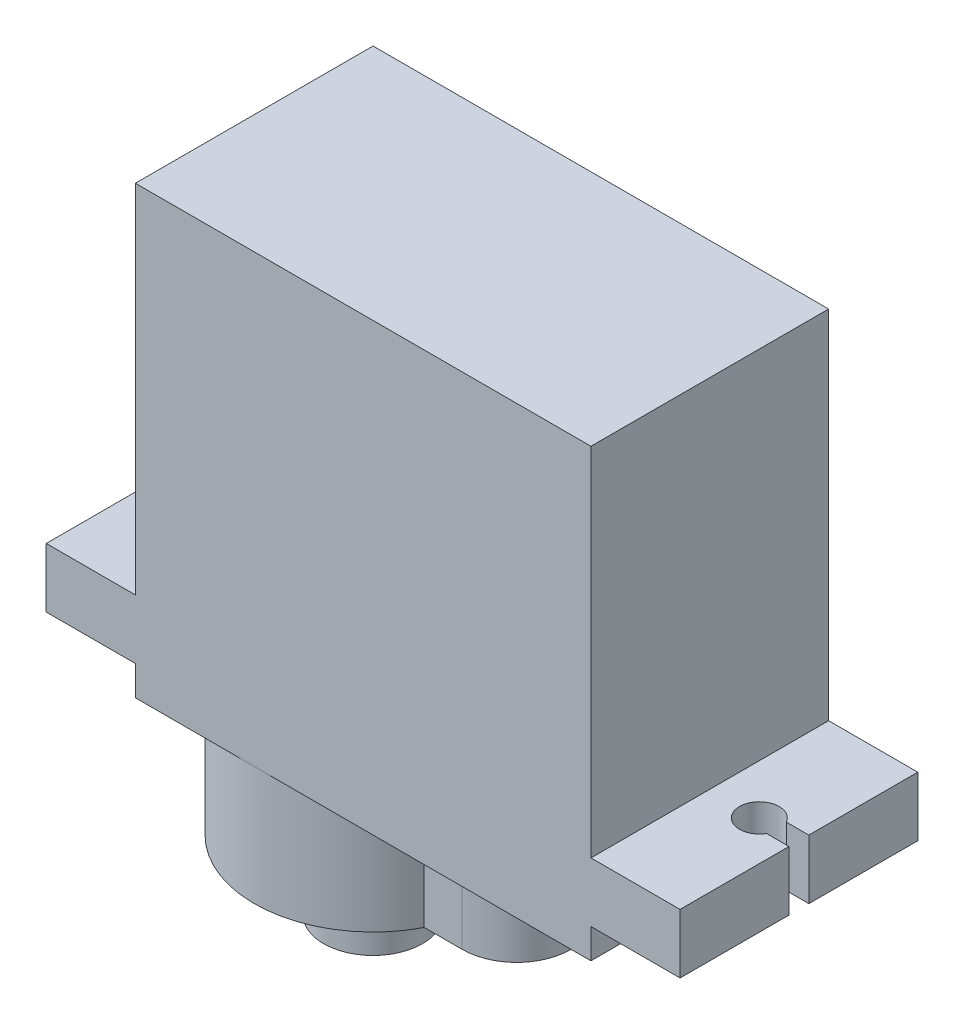
ISO-10303-21;
HEADER;
FILE_DESCRIPTION(('STEP AP214'),'2;1');
FILE_NAME('part.step','',(''),(''),'','','');
FILE_SCHEMA(('AUTOMOTIVE_DESIGN { 1 0 10303 214 1 1 1 1 }'));
ENDSEC;
DATA;
#1=APPLICATION_CONTEXT('core data for automotive mechanical design processes');
#2=APPLICATION_PROTOCOL_DEFINITION('international standard','automotive_design',2000,#1);
#3=PRODUCT_CONTEXT('',#1,'mechanical');
#4=PRODUCT('Part','Part','',(#3));
#5=PRODUCT_RELATED_PRODUCT_CATEGORY('part','',(#4));
#6=PRODUCT_DEFINITION_FORMATION('','',#4);
#7=PRODUCT_DEFINITION_CONTEXT('part definition',#1,'design');
#8=PRODUCT_DEFINITION('design','',#6,#7);
#9=PRODUCT_DEFINITION_SHAPE('','',#8);
#10=(LENGTH_UNIT() NAMED_UNIT(*) SI_UNIT(.MILLI.,.METRE.));
#11=(NAMED_UNIT(*) PLANE_ANGLE_UNIT() SI_UNIT($,.RADIAN.));
#12=(NAMED_UNIT(*) SI_UNIT($,.STERADIAN.) SOLID_ANGLE_UNIT());
#13=UNCERTAINTY_MEASURE_WITH_UNIT(LENGTH_MEASURE(1.E-05),#10,'distance_accuracy_value','');
#14=(GEOMETRIC_REPRESENTATION_CONTEXT(3) GLOBAL_UNCERTAINTY_ASSIGNED_CONTEXT((#13)) GLOBAL_UNIT_ASSIGNED_CONTEXT((#10,
#11,#12)) REPRESENTATION_CONTEXT('',''));
#15=CARTESIAN_POINT('',(0.,0.,0.));
#16=DIRECTION('',(0.,0.,1.));
#17=DIRECTION('',(1.,0.,0.));
#18=AXIS2_PLACEMENT_3D('',#15,#16,#17);
#19=CARTESIAN_POINT('',(-11.5,22.5,6.));
#20=DIRECTION('',(1.,0.,0.));
#21=DIRECTION('',(0.,0.,-1.));
#22=AXIS2_PLACEMENT_3D('',#19,#20,#21);
#23=PLANE('',#22);
#24=DIRECTION('',(0.,0.,-1.));
#25=VECTOR('',#24,1.);
#26=CARTESIAN_POINT('',(-11.5,4.5,6.));
#27=LINE('',#26,#25);
#28=CARTESIAN_POINT('',(-11.5,4.50000000000001,6.));
#29=VERTEX_POINT('',#28);
#30=CARTESIAN_POINT('',(-11.5,4.5,-6.));
#31=VERTEX_POINT('',#30);
#32=EDGE_CURVE('E373',#29,#31,#27,.T.);
#33=ORIENTED_EDGE('',*,*,#32,.F.);
#34=DIRECTION('',(0.,-1.,0.));
#35=VECTOR('',#34,1.);
#36=CARTESIAN_POINT('',(-11.5,22.5,6.));
#37=LINE('',#36,#35);
#38=CARTESIAN_POINT('',(-11.5,22.5,6.));
#39=VERTEX_POINT('',#38);
#40=EDGE_CURVE('E418',#39,#29,#37,.T.);
#41=ORIENTED_EDGE('',*,*,#40,.F.);
#42=DIRECTION('',(0.,0.,1.));
#43=VECTOR('',#42,1.);
#44=CARTESIAN_POINT('',(-11.5,22.5,6.));
#45=LINE('',#44,#43);
#46=CARTESIAN_POINT('',(-11.5,22.5,-6.));
#47=VERTEX_POINT('',#46);
#48=EDGE_CURVE('E398',#47,#39,#45,.T.);
#49=ORIENTED_EDGE('',*,*,#48,.F.);
#50=DIRECTION('',(0.,-1.,0.));
#51=VECTOR('',#50,1.);
#52=CARTESIAN_POINT('',(-11.5,22.5,-6.));
#53=LINE('',#52,#51);
#54=EDGE_CURVE('E422',#47,#31,#53,.T.);
#55=ORIENTED_EDGE('',*,*,#54,.T.);
#56=EDGE_LOOP('',(#33,#41,#49,#55));
#57=FACE_BOUND('',#56,.T.);
#58=DIRECTION('',(0.,-1.,0.));
#59=VECTOR('',#58,1.);
#60=CARTESIAN_POINT('',(-11.5,18.3,-1.5));
#61=LINE('',#60,#59);
#62=CARTESIAN_POINT('',(-11.5,18.3,-1.5));
#63=VERTEX_POINT('',#62);
#64=CARTESIAN_POINT('',(-11.5,17.5,-1.5));
#65=VERTEX_POINT('',#64);
#66=EDGE_CURVE('E250',#63,#65,#61,.T.);
#67=ORIENTED_EDGE('',*,*,#66,.F.);
#68=DIRECTION('',(0.,0.,-1.));
#69=VECTOR('',#68,1.);
#70=CARTESIAN_POINT('',(-11.5,18.3,-1.5));
#71=LINE('',#70,#69);
#72=CARTESIAN_POINT('',(-11.5,18.3,1.5));
#73=VERTEX_POINT('',#72);
#74=EDGE_CURVE('E247',#73,#63,#71,.T.);
#75=ORIENTED_EDGE('',*,*,#74,.F.);
#76=DIRECTION('',(0.,1.,0.));
#77=VECTOR('',#76,1.);
#78=CARTESIAN_POINT('',(-11.5,18.3,1.5));
#79=LINE('',#78,#77);
#80=CARTESIAN_POINT('',(-11.5,17.5,1.5));
#81=VERTEX_POINT('',#80);
#82=EDGE_CURVE('E56',#81,#73,#79,.T.);
#83=ORIENTED_EDGE('',*,*,#82,.F.);
#84=DIRECTION('',(0.,0.,1.));
#85=VECTOR('',#84,1.);
#86=CARTESIAN_POINT('',(-11.5,17.5,-1.5));
#87=LINE('',#86,#85);
#88=EDGE_CURVE('E51',#65,#81,#87,.T.);
#89=ORIENTED_EDGE('',*,*,#88,.F.);
#90=EDGE_LOOP('',(#67,#75,#83,#89));
#91=FACE_BOUND('',#90,.T.);
#92=ADVANCED_FACE('F34',(#57,#91),#23,.F.);
#93=CARTESIAN_POINT('',(0.,0.,0.));
#94=DIRECTION('',(0.,-1.,0.));
#95=DIRECTION('',(0.,0.,-1.));
#96=AXIS2_PLACEMENT_3D('',#93,#94,#95);
#97=PLANE('',#96);
#98=DIRECTION('',(1.,0.,0.));
#99=VECTOR('',#98,1.);
#100=CARTESIAN_POINT('',(1.75000000000001,0.,2.75));
#101=LINE('',#100,#99);
#102=CARTESIAN_POINT('',(-0.167317748074608,0.,2.75));
#103=VERTEX_POINT('',#102);
#104=CARTESIAN_POINT('',(1.75000000000001,0.,2.75));
#105=VERTEX_POINT('',#104);
#106=EDGE_CURVE('E264',#103,#105,#101,.T.);
#107=ORIENTED_EDGE('',*,*,#106,.T.);
#108=CARTESIAN_POINT('',(1.75000000000001,0.,0.));
#109=DIRECTION('',(0.,1.,0.));
#110=DIRECTION('',(0.,0.,1.));
#111=AXIS2_PLACEMENT_3D('',#108,#109,#110);
#112=CIRCLE('',#111,2.75);
#113=CARTESIAN_POINT('',(1.75000000000001,0.,-2.75));
#114=VERTEX_POINT('',#113);
#115=EDGE_CURVE('E251',#105,#114,#112,.T.);
#116=ORIENTED_EDGE('',*,*,#115,.T.);
#117=DIRECTION('',(-1.,0.,0.));
#118=VECTOR('',#117,1.);
#119=CARTESIAN_POINT('',(1.75000000000001,0.,-2.75));
#120=LINE('',#119,#118);
#121=CARTESIAN_POINT('',(-0.167317748074608,0.,-2.75));
#122=VERTEX_POINT('',#121);
#123=EDGE_CURVE('E254',#114,#122,#120,.T.);
#124=ORIENTED_EDGE('',*,*,#123,.T.);
#125=CARTESIAN_POINT('',(-5.49999999999999,0.,0.));
#126=DIRECTION('',(0.,-1.,0.));
#127=DIRECTION('',(0.,0.,-1.));
#128=AXIS2_PLACEMENT_3D('',#125,#126,#127);
#129=CIRCLE('',#128,6.);
#130=CARTESIAN_POINT('',(-5.49999999999999,0.,-6.));
#131=VERTEX_POINT('',#130);
#132=EDGE_CURVE('E290',#131,#122,#129,.T.);
#133=ORIENTED_EDGE('',*,*,#132,.F.);
#134=DIRECTION('',(-1.,0.,0.));
#135=VECTOR('',#134,1.);
#136=CARTESIAN_POINT('',(-11.5,0.,-6.));
#137=LINE('',#136,#135);
#138=CARTESIAN_POINT('',(11.5,0.,-6.));
#139=VERTEX_POINT('',#138);
#140=EDGE_CURVE('E406',#139,#131,#137,.T.);
#141=ORIENTED_EDGE('',*,*,#140,.F.);
#142=DIRECTION('',(0.,0.,-1.));
#143=VECTOR('',#142,1.);
#144=CARTESIAN_POINT('',(11.5,0.,6.));
#145=LINE('',#144,#143);
#146=CARTESIAN_POINT('',(11.5,0.,6.));
#147=VERTEX_POINT('',#146);
#148=EDGE_CURVE('E391',#147,#139,#145,.T.);
#149=ORIENTED_EDGE('',*,*,#148,.F.);
#150=DIRECTION('',(1.,0.,0.));
#151=VECTOR('',#150,1.);
#152=CARTESIAN_POINT('',(-11.5,0.,6.));
#153=LINE('',#152,#151);
#154=CARTESIAN_POINT('',(-5.49999999999999,0.,6.));
#155=VERTEX_POINT('',#154);
#156=EDGE_CURVE('E412',#155,#147,#153,.T.);
#157=ORIENTED_EDGE('',*,*,#156,.F.);
#158=EDGE_CURVE('E284',#103,#155,#129,.T.);
#159=ORIENTED_EDGE('',*,*,#158,.F.);
#160=EDGE_LOOP('',(#107,#116,#124,#133,#141,#149,#157,#159));
#161=FACE_BOUND('',#160,.T.);
#162=ADVANCED_FACE('F450',(#161),#97,.T.);
#163=CARTESIAN_POINT('',(-11.5,0.,0.));
#164=VERTEX_POINT('',#163);
#165=EDGE_CURVE('E43',#155,#164,#129,.T.);
#166=ORIENTED_EDGE('',*,*,#165,.F.);
#167=CARTESIAN_POINT('',(-11.5,0.,6.));
#168=VERTEX_POINT('',#167);
#169=EDGE_CURVE('E396',#168,#155,#153,.T.);
#170=ORIENTED_EDGE('',*,*,#169,.F.);
#171=DIRECTION('',(0.,0.,1.));
#172=VECTOR('',#171,1.);
#173=CARTESIAN_POINT('',(-11.5,0.,6.));
#174=LINE('',#173,#172);
#175=EDGE_CURVE('E408',#164,#168,#174,.T.);
#176=ORIENTED_EDGE('',*,*,#175,.F.);
#177=EDGE_LOOP('',(#166,#170,#176));
#178=FACE_BOUND('',#177,.T.);
#179=ADVANCED_FACE('F448',(#178),#97,.T.);
#180=CARTESIAN_POINT('',(-16.,1.5,6.));
#181=DIRECTION('',(-1.,0.,0.));
#182=DIRECTION('',(0.,0.,1.));
#183=AXIS2_PLACEMENT_3D('',#180,#181,#182);
#184=PLANE('',#183);
#185=DIRECTION('',(0.,-1.,0.));
#186=VECTOR('',#185,1.);
#187=CARTESIAN_POINT('',(-16.,1.5,-0.5));
#188=LINE('',#187,#186);
#189=CARTESIAN_POINT('',(-16.,4.5,-0.5));
#190=VERTEX_POINT('',#189);
#191=CARTESIAN_POINT('',(-16.,1.5,-0.5));
#192=VERTEX_POINT('',#191);
#193=EDGE_CURVE('E335',#190,#192,#188,.T.);
#194=ORIENTED_EDGE('',*,*,#193,.F.);
#195=DIRECTION('',(0.,0.,1.));
#196=VECTOR('',#195,1.);
#197=CARTESIAN_POINT('',(-16.,4.5,6.));
#198=LINE('',#197,#196);
#199=CARTESIAN_POINT('',(-16.,4.5,-6.));
#200=VERTEX_POINT('',#199);
#201=EDGE_CURVE('E363',#200,#190,#198,.T.);
#202=ORIENTED_EDGE('',*,*,#201,.F.);
#203=DIRECTION('',(0.,1.,0.));
#204=VECTOR('',#203,1.);
#205=CARTESIAN_POINT('',(-16.,1.5,-6.));
#206=LINE('',#205,#204);
#207=CARTESIAN_POINT('',(-16.,1.5,-6.));
#208=VERTEX_POINT('',#207);
#209=EDGE_CURVE('E377',#208,#200,#206,.T.);
#210=ORIENTED_EDGE('',*,*,#209,.F.);
#211=DIRECTION('',(0.,0.,1.));
#212=VECTOR('',#211,1.);
#213=CARTESIAN_POINT('',(-16.,1.5,6.));
#214=LINE('',#213,#212);
#215=EDGE_CURVE('E347',#208,#192,#214,.T.);
#216=ORIENTED_EDGE('',*,*,#215,.T.);
#217=EDGE_LOOP('',(#194,#202,#210,#216));
#218=FACE_BOUND('',#217,.T.);
#219=ADVANCED_FACE('F476',(#218),#184,.T.);
#220=CARTESIAN_POINT('',(16.,1.5,6.));
#221=DIRECTION('',(1.,0.,0.));
#222=DIRECTION('',(0.,0.,-1.));
#223=AXIS2_PLACEMENT_3D('',#220,#221,#222);
#224=PLANE('',#223);
#225=DIRECTION('',(0.,-1.,0.));
#226=VECTOR('',#225,1.);
#227=CARTESIAN_POINT('',(16.,1.5,0.5));
#228=LINE('',#227,#226);
#229=CARTESIAN_POINT('',(16.,4.5,0.499999999999999));
#230=VERTEX_POINT('',#229);
#231=CARTESIAN_POINT('',(16.,1.5,0.499999999999999));
#232=VERTEX_POINT('',#231);
#233=EDGE_CURVE('E429',#230,#232,#228,.T.);
#234=ORIENTED_EDGE('',*,*,#233,.F.);
#235=DIRECTION('',(0.,0.,-1.));
#236=VECTOR('',#235,1.);
#237=CARTESIAN_POINT('',(16.,4.5,6.));
#238=LINE('',#237,#236);
#239=CARTESIAN_POINT('',(16.,4.5,6.));
#240=VERTEX_POINT('',#239);
#241=EDGE_CURVE('E355',#240,#230,#238,.T.);
#242=ORIENTED_EDGE('',*,*,#241,.F.);
#243=DIRECTION('',(0.,1.,0.));
#244=VECTOR('',#243,1.);
#245=CARTESIAN_POINT('',(16.,1.5,6.));
#246=LINE('',#245,#244);
#247=CARTESIAN_POINT('',(16.,1.5,6.));
#248=VERTEX_POINT('',#247);
#249=EDGE_CURVE('E370',#248,#240,#246,.T.);
#250=ORIENTED_EDGE('',*,*,#249,.F.);
#251=DIRECTION('',(0.,0.,-1.));
#252=VECTOR('',#251,1.);
#253=CARTESIAN_POINT('',(16.,1.5,6.));
#254=LINE('',#253,#252);
#255=EDGE_CURVE('E338',#248,#232,#254,.T.);
#256=ORIENTED_EDGE('',*,*,#255,.T.);
#257=EDGE_LOOP('',(#234,#242,#250,#256));
#258=FACE_BOUND('',#257,.T.);
#259=ADVANCED_FACE('F513',(#258),#224,.T.);
#260=CARTESIAN_POINT('',(11.5,22.5,6.));
#261=DIRECTION('',(-1.,0.,0.));
#262=DIRECTION('',(0.,0.,1.));
#263=AXIS2_PLACEMENT_3D('',#260,#261,#262);
#264=PLANE('',#263);
#265=DIRECTION('',(0.,0.,1.));
#266=VECTOR('',#265,1.);
#267=CARTESIAN_POINT('',(11.5,4.5,6.));
#268=LINE('',#267,#266);
#269=CARTESIAN_POINT('',(11.5,4.50000000000001,-6.));
#270=VERTEX_POINT('',#269);
#271=CARTESIAN_POINT('',(11.5,4.5,6.));
#272=VERTEX_POINT('',#271);
#273=EDGE_CURVE('E384',#270,#272,#268,.T.);
#274=ORIENTED_EDGE('',*,*,#273,.F.);
#275=DIRECTION('',(0.,-1.,0.));
#276=VECTOR('',#275,1.);
#277=CARTESIAN_POINT('',(11.5,22.5,-6.));
#278=LINE('',#277,#276);
#279=CARTESIAN_POINT('',(11.5,22.5,-6.));
#280=VERTEX_POINT('',#279);
#281=EDGE_CURVE('E425',#280,#270,#278,.T.);
#282=ORIENTED_EDGE('',*,*,#281,.F.);
#283=DIRECTION('',(0.,0.,-1.));
#284=VECTOR('',#283,1.);
#285=CARTESIAN_POINT('',(11.5,22.5,6.));
#286=LINE('',#285,#284);
#287=CARTESIAN_POINT('',(11.5,22.5,6.));
#288=VERTEX_POINT('',#287);
#289=EDGE_CURVE('E392',#288,#280,#286,.T.);
#290=ORIENTED_EDGE('',*,*,#289,.F.);
#291=DIRECTION('',(0.,-1.,0.));
#292=VECTOR('',#291,1.);
#293=CARTESIAN_POINT('',(11.5,22.5,6.));
#294=LINE('',#293,#292);
#295=EDGE_CURVE('E415',#288,#272,#294,.T.);
#296=ORIENTED_EDGE('',*,*,#295,.T.);
#297=EDGE_LOOP('',(#274,#282,#290,#296));
#298=FACE_BOUND('',#297,.T.);
#299=ADVANCED_FACE('F490',(#298),#264,.F.);
#300=CARTESIAN_POINT('',(11.5,1.50000000000001,-6.));
#301=VERTEX_POINT('',#300);
#302=EDGE_CURVE('E424',#301,#139,#278,.T.);
#303=ORIENTED_EDGE('',*,*,#302,.F.);
#304=DIRECTION('',(0.,0.,1.));
#305=VECTOR('',#304,1.);
#306=CARTESIAN_POINT('',(11.5,1.5,6.));
#307=LINE('',#306,#305);
#308=CARTESIAN_POINT('',(11.5,1.50000000000001,6.));
#309=VERTEX_POINT('',#308);
#310=EDGE_CURVE('E389',#301,#309,#307,.T.);
#311=ORIENTED_EDGE('',*,*,#310,.T.);
#312=EDGE_CURVE('E402',#309,#147,#294,.T.);
#313=ORIENTED_EDGE('',*,*,#312,.T.);
#314=ORIENTED_EDGE('',*,*,#148,.T.);
#315=EDGE_LOOP('',(#303,#311,#313,#314));
#316=FACE_BOUND('',#315,.T.);
#317=ADVANCED_FACE('F36',(#316),#264,.F.);
#318=CARTESIAN_POINT('',(-11.5,22.5,-6.));
#319=DIRECTION('',(0.,0.,1.));
#320=DIRECTION('',(1.,0.,0.));
#321=AXIS2_PLACEMENT_3D('',#318,#319,#320);
#322=PLANE('',#321);
#323=CARTESIAN_POINT('',(-11.5,1.50000000000001,-6.));
#324=VERTEX_POINT('',#323);
#325=CARTESIAN_POINT('',(-11.5,0.,-6.));
#326=VERTEX_POINT('',#325);
#327=EDGE_CURVE('E421',#324,#326,#53,.T.);
#328=ORIENTED_EDGE('',*,*,#327,.F.);
#329=DIRECTION('',(-1.,0.,0.));
#330=VECTOR('',#329,1.);
#331=CARTESIAN_POINT('',(-16.,1.5,-6.));
#332=LINE('',#331,#330);
#333=EDGE_CURVE('E341',#324,#208,#332,.T.);
#334=ORIENTED_EDGE('',*,*,#333,.T.);
#335=ORIENTED_EDGE('',*,*,#209,.T.);
#336=DIRECTION('',(-1.,0.,0.));
#337=VECTOR('',#336,1.);
#338=CARTESIAN_POINT('',(-16.,4.5,-6.));
#339=LINE('',#338,#337);
#340=EDGE_CURVE('E358',#31,#200,#339,.T.);
#341=ORIENTED_EDGE('',*,*,#340,.F.);
#342=ORIENTED_EDGE('',*,*,#54,.F.);
#343=DIRECTION('',(-1.,0.,0.));
#344=VECTOR('',#343,1.);
#345=CARTESIAN_POINT('',(-11.5,22.5,-6.));
#346=LINE('',#345,#344);
#347=EDGE_CURVE('E395',#280,#47,#346,.T.);
#348=ORIENTED_EDGE('',*,*,#347,.F.);
#349=ORIENTED_EDGE('',*,*,#281,.T.);
#350=CARTESIAN_POINT('',(16.,4.5,-6.));
#351=VERTEX_POINT('',#350);
#352=EDGE_CURVE('E359',#351,#270,#339,.T.);
#353=ORIENTED_EDGE('',*,*,#352,.F.);
#354=DIRECTION('',(0.,1.,0.));
#355=VECTOR('',#354,1.);
#356=CARTESIAN_POINT('',(16.,1.5,-6.));
#357=LINE('',#356,#355);
#358=CARTESIAN_POINT('',(16.,1.5,-6.));
#359=VERTEX_POINT('',#358);
#360=EDGE_CURVE('E354',#359,#351,#357,.T.);
#361=ORIENTED_EDGE('',*,*,#360,.F.);
#362=EDGE_CURVE('E343',#359,#301,#332,.T.);
#363=ORIENTED_EDGE('',*,*,#362,.T.);
#364=ORIENTED_EDGE('',*,*,#302,.T.);
#365=ORIENTED_EDGE('',*,*,#140,.T.);
#366=EDGE_CURVE('E405',#131,#326,#137,.T.);
#367=ORIENTED_EDGE('',*,*,#366,.T.);
#368=EDGE_LOOP('',(#328,#334,#335,#341,#342,#348,#349,#353,#361,#363,#364,#365,#367));
#369=FACE_BOUND('',#368,.T.);
#370=ADVANCED_FACE('F471',(#369),#322,.F.);
#371=CARTESIAN_POINT('',(-11.5,1.50000000000001,6.));
#372=VERTEX_POINT('',#371);
#373=EDGE_CURVE('E417',#372,#168,#37,.T.);
#374=ORIENTED_EDGE('',*,*,#373,.F.);
#375=DIRECTION('',(0.,0.,-1.));
#376=VECTOR('',#375,1.);
#377=CARTESIAN_POINT('',(-11.5,1.5,6.));
#378=LINE('',#377,#376);
#379=EDGE_CURVE('E387',#372,#324,#378,.T.);
#380=ORIENTED_EDGE('',*,*,#379,.T.);
#381=ORIENTED_EDGE('',*,*,#327,.T.);
#382=EDGE_CURVE('E409',#326,#164,#174,.T.);
#383=ORIENTED_EDGE('',*,*,#382,.T.);
#384=ORIENTED_EDGE('',*,*,#175,.T.);
#385=EDGE_LOOP('',(#374,#380,#381,#383,#384));
#386=FACE_BOUND('',#385,.T.);
#387=ADVANCED_FACE('F461',(#386),#23,.F.);
#388=CARTESIAN_POINT('',(-11.5,22.5,6.));
#389=DIRECTION('',(0.,0.,-1.));
#390=DIRECTION('',(-1.,0.,0.));
#391=AXIS2_PLACEMENT_3D('',#388,#389,#390);
#392=PLANE('',#391);
#393=ORIENTED_EDGE('',*,*,#312,.F.);
#394=DIRECTION('',(1.,0.,0.));
#395=VECTOR('',#394,1.);
#396=CARTESIAN_POINT('',(-16.,1.5,6.));
#397=LINE('',#396,#395);
#398=EDGE_CURVE('E350',#309,#248,#397,.T.);
#399=ORIENTED_EDGE('',*,*,#398,.T.);
#400=ORIENTED_EDGE('',*,*,#249,.T.);
#401=DIRECTION('',(1.,0.,0.));
#402=VECTOR('',#401,1.);
#403=CARTESIAN_POINT('',(-16.,4.5,6.));
#404=LINE('',#403,#402);
#405=EDGE_CURVE('E366',#272,#240,#404,.T.);
#406=ORIENTED_EDGE('',*,*,#405,.F.);
#407=ORIENTED_EDGE('',*,*,#295,.F.);
#408=DIRECTION('',(1.,0.,0.));
#409=VECTOR('',#408,1.);
#410=CARTESIAN_POINT('',(-11.5,22.5,6.));
#411=LINE('',#410,#409);
#412=EDGE_CURVE('E400',#39,#288,#411,.T.);
#413=ORIENTED_EDGE('',*,*,#412,.F.);
#414=ORIENTED_EDGE('',*,*,#40,.T.);
#415=CARTESIAN_POINT('',(-16.,4.5,6.));
#416=VERTEX_POINT('',#415);
#417=EDGE_CURVE('E367',#416,#29,#404,.T.);
#418=ORIENTED_EDGE('',*,*,#417,.F.);
#419=DIRECTION('',(0.,1.,0.));
#420=VECTOR('',#419,1.);
#421=CARTESIAN_POINT('',(-16.,1.5,6.));
#422=LINE('',#421,#420);
#423=CARTESIAN_POINT('',(-16.,1.5,6.));
#424=VERTEX_POINT('',#423);
#425=EDGE_CURVE('E374',#424,#416,#422,.T.);
#426=ORIENTED_EDGE('',*,*,#425,.F.);
#427=EDGE_CURVE('E351',#424,#372,#397,.T.);
#428=ORIENTED_EDGE('',*,*,#427,.T.);
#429=ORIENTED_EDGE('',*,*,#373,.T.);
#430=ORIENTED_EDGE('',*,*,#169,.T.);
#431=ORIENTED_EDGE('',*,*,#156,.T.);
#432=EDGE_LOOP('',(#393,#399,#400,#406,#407,#413,#414,#418,#426,#428,#429,#430,#431));
#433=FACE_BOUND('',#432,.T.);
#434=ADVANCED_FACE('F456',(#433),#392,.F.);
#435=CARTESIAN_POINT('',(0.,22.5,0.));
#436=DIRECTION('',(0.,-1.,0.));
#437=DIRECTION('',(0.,0.,-1.));
#438=AXIS2_PLACEMENT_3D('',#435,#436,#437);
#439=PLANE('',#438);
#440=ORIENTED_EDGE('',*,*,#289,.T.);
#441=ORIENTED_EDGE('',*,*,#347,.T.);
#442=ORIENTED_EDGE('',*,*,#48,.T.);
#443=ORIENTED_EDGE('',*,*,#412,.T.);
#444=EDGE_LOOP('',(#440,#441,#442,#443));
#445=FACE_BOUND('',#444,.T.);
#446=ADVANCED_FACE('F485',(#445),#439,.F.);
#447=EDGE_CURVE('E293',#164,#131,#129,.T.);
#448=ORIENTED_EDGE('',*,*,#447,.F.);
#449=ORIENTED_EDGE('',*,*,#382,.F.);
#450=ORIENTED_EDGE('',*,*,#366,.F.);
#451=EDGE_LOOP('',(#448,#449,#450));
#452=FACE_BOUND('',#451,.T.);
#453=ADVANCED_FACE('F549',(#452),#97,.T.);
#454=DIRECTION('',(0.,1.,0.));
#455=VECTOR('',#454,1.);
#456=CARTESIAN_POINT('',(-16.,1.5,0.5));
#457=LINE('',#456,#455);
#458=CARTESIAN_POINT('',(-16.,1.5,0.499999999999999));
#459=VERTEX_POINT('',#458);
#460=CARTESIAN_POINT('',(-16.,4.5,0.499999999999999));
#461=VERTEX_POINT('',#460);
#462=EDGE_CURVE('E312',#459,#461,#457,.T.);
#463=ORIENTED_EDGE('',*,*,#462,.F.);
#464=EDGE_CURVE('E346',#459,#424,#214,.T.);
#465=ORIENTED_EDGE('',*,*,#464,.T.);
#466=ORIENTED_EDGE('',*,*,#425,.T.);
#467=EDGE_CURVE('E362',#461,#416,#198,.T.);
#468=ORIENTED_EDGE('',*,*,#467,.F.);
#469=EDGE_LOOP('',(#463,#465,#466,#468));
#470=FACE_BOUND('',#469,.T.);
#471=ADVANCED_FACE('F524',(#470),#184,.T.);
#472=CARTESIAN_POINT('',(0.,4.5,0.));
#473=DIRECTION('',(0.,-1.,0.));
#474=DIRECTION('',(0.,0.,-1.));
#475=AXIS2_PLACEMENT_3D('',#472,#473,#474);
#476=PLANE('',#475);
#477=ORIENTED_EDGE('',*,*,#201,.T.);
#478=DIRECTION('',(1.,0.,0.));
#479=VECTOR('',#478,1.);
#480=CARTESIAN_POINT('',(-16.9410455671584,4.5,-0.5));
#481=LINE('',#480,#479);
#482=CARTESIAN_POINT('',(-14.8660254037844,4.5,-0.499999999999999));
#483=VERTEX_POINT('',#482);
#484=EDGE_CURVE('E301',#190,#483,#481,.T.);
#485=ORIENTED_EDGE('',*,*,#484,.T.);
#486=CARTESIAN_POINT('',(-14.,4.5,0.));
#487=DIRECTION('',(0.,-1.,0.));
#488=DIRECTION('',(0.,0.,-1.));
#489=AXIS2_PLACEMENT_3D('',#486,#487,#488);
#490=CIRCLE('',#489,1.);
#491=CARTESIAN_POINT('',(-14.8660254037844,4.5,0.499999999999999));
#492=VERTEX_POINT('',#491);
#493=EDGE_CURVE('E294',#483,#492,#490,.T.);
#494=ORIENTED_EDGE('',*,*,#493,.T.);
#495=DIRECTION('',(-1.,0.,0.));
#496=VECTOR('',#495,1.);
#497=CARTESIAN_POINT('',(-16.9410455671584,4.5,0.5));
#498=LINE('',#497,#496);
#499=EDGE_CURVE('E297',#492,#461,#498,.T.);
#500=ORIENTED_EDGE('',*,*,#499,.T.);
#501=ORIENTED_EDGE('',*,*,#467,.T.);
#502=ORIENTED_EDGE('',*,*,#417,.T.);
#503=ORIENTED_EDGE('',*,*,#32,.T.);
#504=ORIENTED_EDGE('',*,*,#340,.T.);
#505=EDGE_LOOP('',(#477,#485,#494,#500,#501,#502,#503,#504));
#506=FACE_BOUND('',#505,.T.);
#507=ADVANCED_FACE('F478',(#506),#476,.F.);
#508=CARTESIAN_POINT('',(0.,1.5,0.));
#509=DIRECTION('',(0.,-1.,0.));
#510=DIRECTION('',(0.,0.,-1.));
#511=AXIS2_PLACEMENT_3D('',#508,#509,#510);
#512=PLANE('',#511);
#513=DIRECTION('',(1.,0.,0.));
#514=VECTOR('',#513,1.);
#515=CARTESIAN_POINT('',(0.,1.5,-0.499999999999994));
#516=LINE('',#515,#514);
#517=CARTESIAN_POINT('',(-14.8660254037844,1.5,-0.499999999999999));
#518=VERTEX_POINT('',#517);
#519=EDGE_CURVE('E38',#192,#518,#516,.T.);
#520=ORIENTED_EDGE('',*,*,#519,.F.);
#521=ORIENTED_EDGE('',*,*,#215,.F.);
#522=ORIENTED_EDGE('',*,*,#333,.F.);
#523=ORIENTED_EDGE('',*,*,#379,.F.);
#524=ORIENTED_EDGE('',*,*,#427,.F.);
#525=ORIENTED_EDGE('',*,*,#464,.F.);
#526=DIRECTION('',(-1.,0.,0.));
#527=VECTOR('',#526,1.);
#528=CARTESIAN_POINT('',(-16.9410455671584,1.5,0.5));
#529=LINE('',#528,#527);
#530=CARTESIAN_POINT('',(-14.8660254037844,1.5,0.499999999999999));
#531=VERTEX_POINT('',#530);
#532=EDGE_CURVE('E298',#531,#459,#529,.T.);
#533=ORIENTED_EDGE('',*,*,#532,.F.);
#534=CARTESIAN_POINT('',(-14.,1.5,0.));
#535=DIRECTION('',(0.,-1.,0.));
#536=DIRECTION('',(0.,0.,-1.));
#537=AXIS2_PLACEMENT_3D('',#534,#535,#536);
#538=CIRCLE('',#537,1.);
#539=EDGE_CURVE('E305',#518,#531,#538,.T.);
#540=ORIENTED_EDGE('',*,*,#539,.F.);
#541=EDGE_LOOP('',(#520,#521,#522,#523,#524,#525,#533,#540));
#542=FACE_BOUND('',#541,.T.);
#543=ADVANCED_FACE('F466',(#542),#512,.T.);
#544=DIRECTION('',(-1.,0.,0.));
#545=VECTOR('',#544,1.);
#546=CARTESIAN_POINT('',(16.9410455671584,1.5,0.5));
#547=LINE('',#546,#545);
#548=CARTESIAN_POINT('',(14.8660254037844,1.5,0.499999999999999));
#549=VERTEX_POINT('',#548);
#550=EDGE_CURVE('E319',#232,#549,#547,.T.);
#551=ORIENTED_EDGE('',*,*,#550,.F.);
#552=ORIENTED_EDGE('',*,*,#255,.F.);
#553=ORIENTED_EDGE('',*,*,#398,.F.);
#554=ORIENTED_EDGE('',*,*,#310,.F.);
#555=ORIENTED_EDGE('',*,*,#362,.F.);
#556=CARTESIAN_POINT('',(16.,1.5,-0.5));
#557=VERTEX_POINT('',#556);
#558=EDGE_CURVE('E342',#557,#359,#254,.T.);
#559=ORIENTED_EDGE('',*,*,#558,.F.);
#560=DIRECTION('',(1.,0.,0.));
#561=VECTOR('',#560,1.);
#562=CARTESIAN_POINT('',(16.9410455671584,1.5,-0.5));
#563=LINE('',#562,#561);
#564=CARTESIAN_POINT('',(14.8660254037844,1.5,-0.499999999999999));
#565=VERTEX_POINT('',#564);
#566=EDGE_CURVE('E328',#565,#557,#563,.T.);
#567=ORIENTED_EDGE('',*,*,#566,.F.);
#568=CARTESIAN_POINT('',(14.,1.5,0.));
#569=DIRECTION('',(0.,-1.,0.));
#570=DIRECTION('',(0.,0.,1.));
#571=AXIS2_PLACEMENT_3D('',#568,#569,#570);
#572=CIRCLE('',#571,1.);
#573=EDGE_CURVE('E289',#549,#565,#572,.T.);
#574=ORIENTED_EDGE('',*,*,#573,.F.);
#575=EDGE_LOOP('',(#551,#552,#553,#554,#555,#559,#567,#574));
#576=FACE_BOUND('',#575,.T.);
#577=ADVANCED_FACE('F505',(#576),#512,.T.);
#578=ORIENTED_EDGE('',*,*,#241,.T.);
#579=DIRECTION('',(-1.,0.,0.));
#580=VECTOR('',#579,1.);
#581=CARTESIAN_POINT('',(16.9410455671584,4.5,0.5));
#582=LINE('',#581,#580);
#583=CARTESIAN_POINT('',(14.8660254037844,4.5,0.499999999999999));
#584=VERTEX_POINT('',#583);
#585=EDGE_CURVE('E322',#230,#584,#582,.T.);
#586=ORIENTED_EDGE('',*,*,#585,.T.);
#587=CARTESIAN_POINT('',(14.,4.5,0.));
#588=DIRECTION('',(0.,-1.,0.));
#589=DIRECTION('',(0.,0.,1.));
#590=AXIS2_PLACEMENT_3D('',#587,#588,#589);
#591=CIRCLE('',#590,1.);
#592=CARTESIAN_POINT('',(14.8660254037844,4.5,-0.499999999999999));
#593=VERTEX_POINT('',#592);
#594=EDGE_CURVE('E315',#584,#593,#591,.T.);
#595=ORIENTED_EDGE('',*,*,#594,.T.);
#596=DIRECTION('',(1.,0.,0.));
#597=VECTOR('',#596,1.);
#598=CARTESIAN_POINT('',(16.9410455671584,4.5,-0.5));
#599=LINE('',#598,#597);
#600=CARTESIAN_POINT('',(16.,4.5,-0.5));
#601=VERTEX_POINT('',#600);
#602=EDGE_CURVE('E318',#593,#601,#599,.T.);
#603=ORIENTED_EDGE('',*,*,#602,.T.);
#604=EDGE_CURVE('E337',#601,#351,#238,.T.);
#605=ORIENTED_EDGE('',*,*,#604,.T.);
#606=ORIENTED_EDGE('',*,*,#352,.T.);
#607=ORIENTED_EDGE('',*,*,#273,.T.);
#608=ORIENTED_EDGE('',*,*,#405,.T.);
#609=EDGE_LOOP('',(#578,#586,#595,#603,#605,#606,#607,#608));
#610=FACE_BOUND('',#609,.T.);
#611=ADVANCED_FACE('F494',(#610),#476,.F.);
#612=DIRECTION('',(0.,1.,0.));
#613=VECTOR('',#612,1.);
#614=CARTESIAN_POINT('',(16.,1.5,-0.5));
#615=LINE('',#614,#613);
#616=EDGE_CURVE('E428',#557,#601,#615,.T.);
#617=ORIENTED_EDGE('',*,*,#616,.F.);
#618=ORIENTED_EDGE('',*,*,#558,.T.);
#619=ORIENTED_EDGE('',*,*,#360,.T.);
#620=ORIENTED_EDGE('',*,*,#604,.F.);
#621=EDGE_LOOP('',(#617,#618,#619,#620));
#622=FACE_BOUND('',#621,.T.);
#623=ADVANCED_FACE('F500',(#622),#224,.T.);
#624=CARTESIAN_POINT('',(14.,4.5,0.));
#625=DIRECTION('',(0.,-1.,0.));
#626=DIRECTION('',(0.,0.,-1.));
#627=AXIS2_PLACEMENT_3D('',#624,#625,#626);
#628=CYLINDRICAL_SURFACE('',#627,1.);
#629=ORIENTED_EDGE('',*,*,#573,.T.);
#630=DIRECTION('',(0.,-1.,0.));
#631=VECTOR('',#630,1.);
#632=CARTESIAN_POINT('',(14.8660254037844,4.5,-0.499999999999999));
#633=LINE('',#632,#631);
#634=EDGE_CURVE('E325',#593,#565,#633,.T.);
#635=ORIENTED_EDGE('',*,*,#634,.F.);
#636=ORIENTED_EDGE('',*,*,#594,.F.);
#637=DIRECTION('',(0.,-1.,0.));
#638=VECTOR('',#637,1.);
#639=CARTESIAN_POINT('',(14.8660254037844,4.5,0.499999999999999));
#640=LINE('',#639,#638);
#641=EDGE_CURVE('E307',#584,#549,#640,.T.);
#642=ORIENTED_EDGE('',*,*,#641,.T.);
#643=EDGE_LOOP('',(#629,#635,#636,#642));
#644=FACE_BOUND('',#643,.T.);
#645=ADVANCED_FACE('F518',(#644),#628,.F.);
#646=CARTESIAN_POINT('',(16.9410455671584,4.5,0.5));
#647=DIRECTION('',(0.,0.,1.));
#648=DIRECTION('',(1.,0.,0.));
#649=AXIS2_PLACEMENT_3D('',#646,#647,#648);
#650=PLANE('',#649);
#651=ORIENTED_EDGE('',*,*,#233,.T.);
#652=ORIENTED_EDGE('',*,*,#550,.T.);
#653=ORIENTED_EDGE('',*,*,#641,.F.);
#654=ORIENTED_EDGE('',*,*,#585,.F.);
#655=EDGE_LOOP('',(#651,#652,#653,#654));
#656=FACE_BOUND('',#655,.T.);
#657=ADVANCED_FACE('F515',(#656),#650,.F.);
#658=CARTESIAN_POINT('',(16.9410455671584,4.5,-0.5));
#659=DIRECTION('',(0.,0.,-1.));
#660=DIRECTION('',(-1.,0.,0.));
#661=AXIS2_PLACEMENT_3D('',#658,#659,#660);
#662=PLANE('',#661);
#663=ORIENTED_EDGE('',*,*,#616,.T.);
#664=ORIENTED_EDGE('',*,*,#602,.F.);
#665=ORIENTED_EDGE('',*,*,#634,.T.);
#666=ORIENTED_EDGE('',*,*,#566,.T.);
#667=EDGE_LOOP('',(#663,#664,#665,#666));
#668=FACE_BOUND('',#667,.T.);
#669=ADVANCED_FACE('F540',(#668),#662,.F.);
#670=CARTESIAN_POINT('',(-14.,4.5,0.));
#671=DIRECTION('',(0.,-1.,0.));
#672=DIRECTION('',(0.,0.,-1.));
#673=AXIS2_PLACEMENT_3D('',#670,#671,#672);
#674=CYLINDRICAL_SURFACE('',#673,1.);
#675=ORIENTED_EDGE('',*,*,#539,.T.);
#676=DIRECTION('',(0.,-1.,0.));
#677=VECTOR('',#676,1.);
#678=CARTESIAN_POINT('',(-14.8660254037844,4.5,0.499999999999999));
#679=LINE('',#678,#677);
#680=EDGE_CURVE('E304',#492,#531,#679,.T.);
#681=ORIENTED_EDGE('',*,*,#680,.F.);
#682=ORIENTED_EDGE('',*,*,#493,.F.);
#683=DIRECTION('',(0.,-1.,0.));
#684=VECTOR('',#683,1.);
#685=CARTESIAN_POINT('',(-14.8660254037844,4.5,-0.499999999999999));
#686=LINE('',#685,#684);
#687=EDGE_CURVE('E309',#483,#518,#686,.T.);
#688=ORIENTED_EDGE('',*,*,#687,.T.);
#689=EDGE_LOOP('',(#675,#681,#682,#688));
#690=FACE_BOUND('',#689,.T.);
#691=ADVANCED_FACE('F531',(#690),#674,.F.);
#692=CARTESIAN_POINT('',(-16.9410455671584,4.5,-0.5));
#693=DIRECTION('',(0.,0.,-1.));
#694=DIRECTION('',(-1.,0.,0.));
#695=AXIS2_PLACEMENT_3D('',#692,#693,#694);
#696=PLANE('',#695);
#697=ORIENTED_EDGE('',*,*,#193,.T.);
#698=ORIENTED_EDGE('',*,*,#519,.T.);
#699=ORIENTED_EDGE('',*,*,#687,.F.);
#700=ORIENTED_EDGE('',*,*,#484,.F.);
#701=EDGE_LOOP('',(#697,#698,#699,#700));
#702=FACE_BOUND('',#701,.T.);
#703=ADVANCED_FACE('F532',(#702),#696,.F.);
#704=CARTESIAN_POINT('',(-16.9410455671584,4.5,0.5));
#705=DIRECTION('',(0.,0.,1.));
#706=DIRECTION('',(1.,0.,0.));
#707=AXIS2_PLACEMENT_3D('',#704,#705,#706);
#708=PLANE('',#707);
#709=ORIENTED_EDGE('',*,*,#462,.T.);
#710=ORIENTED_EDGE('',*,*,#499,.F.);
#711=ORIENTED_EDGE('',*,*,#680,.T.);
#712=ORIENTED_EDGE('',*,*,#532,.T.);
#713=EDGE_LOOP('',(#709,#710,#711,#712));
#714=FACE_BOUND('',#713,.T.);
#715=ADVANCED_FACE('F528',(#714),#708,.F.);
#716=CARTESIAN_POINT('',(-5.49999999999999,-6.,0.));
#717=DIRECTION('',(0.,1.,0.));
#718=DIRECTION('',(0.,0.,1.));
#719=AXIS2_PLACEMENT_3D('',#716,#717,#718);
#720=CYLINDRICAL_SURFACE('',#719,6.);
#721=CARTESIAN_POINT('',(-5.49999999999999,-6.,0.));
#722=DIRECTION('',(0.,-1.,0.));
#723=DIRECTION('',(0.,0.,-1.));
#724=AXIS2_PLACEMENT_3D('',#721,#722,#723);
#725=CIRCLE('',#724,6.);
#726=CARTESIAN_POINT('',(-0.167317748074608,-6.,2.75));
#727=VERTEX_POINT('',#726);
#728=CARTESIAN_POINT('',(-0.167317748074608,-6.,-2.75));
#729=VERTEX_POINT('',#728);
#730=EDGE_CURVE('E286',#727,#729,#725,.T.);
#731=ORIENTED_EDGE('',*,*,#730,.F.);
#732=DIRECTION('',(0.,1.,0.));
#733=VECTOR('',#732,1.);
#734=CARTESIAN_POINT('',(-0.167317748074608,-6.,2.75));
#735=LINE('',#734,#733);
#736=EDGE_CURVE('E279',#727,#103,#735,.T.);
#737=ORIENTED_EDGE('',*,*,#736,.T.);
#738=ORIENTED_EDGE('',*,*,#158,.T.);
#739=ORIENTED_EDGE('',*,*,#165,.T.);
#740=ORIENTED_EDGE('',*,*,#447,.T.);
#741=ORIENTED_EDGE('',*,*,#132,.T.);
#742=DIRECTION('',(0.,1.,0.));
#743=VECTOR('',#742,1.);
#744=CARTESIAN_POINT('',(-0.167317748074608,-6.,-2.75));
#745=LINE('',#744,#743);
#746=EDGE_CURVE('E275',#122,#729,#745,.F.);
#747=ORIENTED_EDGE('',*,*,#746,.T.);
#748=EDGE_LOOP('',(#731,#737,#738,#739,#740,#741,#747));
#749=FACE_BOUND('',#748,.T.);
#750=ADVANCED_FACE('F441',(#749),#720,.T.);
#751=CARTESIAN_POINT('',(-5.49999999999999,-6.,0.));
#752=DIRECTION('',(0.,-1.,0.));
#753=DIRECTION('',(0.,0.,-1.));
#754=AXIS2_PLACEMENT_3D('',#751,#752,#753);
#755=PLANE('',#754);
#756=ORIENTED_EDGE('',*,*,#730,.T.);
#757=DIRECTION('',(-1.,0.,0.));
#758=VECTOR('',#757,1.);
#759=CARTESIAN_POINT('',(1.75000000000001,-6.,-2.75));
#760=LINE('',#759,#758);
#761=CARTESIAN_POINT('',(1.75000000000001,-6.,-2.75));
#762=VERTEX_POINT('',#761);
#763=EDGE_CURVE('E263',#762,#729,#760,.T.);
#764=ORIENTED_EDGE('',*,*,#763,.F.);
#765=CARTESIAN_POINT('',(1.75000000000001,-6.,0.));
#766=DIRECTION('',(0.,1.,0.));
#767=DIRECTION('',(0.,0.,1.));
#768=AXIS2_PLACEMENT_3D('',#765,#766,#767);
#769=CIRCLE('',#768,2.75);
#770=CARTESIAN_POINT('',(1.75000000000001,-6.,2.75));
#771=VERTEX_POINT('',#770);
#772=EDGE_CURVE('E260',#771,#762,#769,.T.);
#773=ORIENTED_EDGE('',*,*,#772,.F.);
#774=DIRECTION('',(1.,0.,0.));
#775=VECTOR('',#774,1.);
#776=CARTESIAN_POINT('',(1.75000000000001,-6.,2.75));
#777=LINE('',#776,#775);
#778=EDGE_CURVE('E266',#727,#771,#777,.T.);
#779=ORIENTED_EDGE('',*,*,#778,.F.);
#780=EDGE_LOOP('',(#756,#764,#773,#779));
#781=FACE_BOUND('',#780,.T.);
#782=CARTESIAN_POINT('',(-5.49999999999999,-6.,0.));
#783=DIRECTION('',(0.,-1.,0.));
#784=DIRECTION('',(0.,0.,-1.));
#785=AXIS2_PLACEMENT_3D('',#782,#783,#784);
#786=CIRCLE('',#785,2.5);
#787=CARTESIAN_POINT('',(-5.49999999999999,-6.,-2.5));
#788=VERTEX_POINT('',#787);
#789=EDGE_CURVE('E11',#788,#788,#786,.T.);
#790=ORIENTED_EDGE('',*,*,#789,.F.);
#791=EDGE_LOOP('',(#790));
#792=FACE_BOUND('',#791,.T.);
#793=ADVANCED_FACE('F685',(#781,#792),#755,.T.);
#794=CARTESIAN_POINT('',(-5.49999999999999,-9.5,0.));
#795=DIRECTION('',(0.,1.,0.));
#796=DIRECTION('',(0.,0.,1.));
#797=AXIS2_PLACEMENT_3D('',#794,#795,#796);
#798=CYLINDRICAL_SURFACE('',#797,2.5);
#799=CARTESIAN_POINT('',(-5.49999999999999,-9.5,0.));
#800=DIRECTION('',(0.,-1.,0.));
#801=DIRECTION('',(0.,0.,-1.));
#802=AXIS2_PLACEMENT_3D('',#799,#800,#801);
#803=CIRCLE('',#802,2.5);
#804=CARTESIAN_POINT('',(-5.49999999999999,-9.5,-2.5));
#805=VERTEX_POINT('',#804);
#806=EDGE_CURVE('E282',#805,#805,#803,.T.);
#807=ORIENTED_EDGE('',*,*,#806,.F.);
#808=EDGE_LOOP('',(#807));
#809=FACE_BOUND('',#808,.T.);
#810=ORIENTED_EDGE('',*,*,#789,.T.);
#811=EDGE_LOOP('',(#810));
#812=FACE_BOUND('',#811,.T.);
#813=ADVANCED_FACE('F691',(#809,#812),#798,.T.);
#814=CARTESIAN_POINT('',(-5.49999999999999,-9.5,0.));
#815=DIRECTION('',(0.,-1.,0.));
#816=DIRECTION('',(0.,0.,-1.));
#817=AXIS2_PLACEMENT_3D('',#814,#815,#816);
#818=PLANE('',#817);
#819=ORIENTED_EDGE('',*,*,#806,.T.);
#820=EDGE_LOOP('',(#819));
#821=FACE_BOUND('',#820,.T.);
#822=ADVANCED_FACE('F700',(#821),#818,.T.);
#823=CARTESIAN_POINT('',(1.75000000000001,-6.,2.75));
#824=DIRECTION('',(0.,0.,1.));
#825=DIRECTION('',(1.,0.,0.));
#826=AXIS2_PLACEMENT_3D('',#823,#824,#825);
#827=PLANE('',#826);
#828=ORIENTED_EDGE('',*,*,#736,.F.);
#829=ORIENTED_EDGE('',*,*,#778,.T.);
#830=DIRECTION('',(0.,1.,0.));
#831=VECTOR('',#830,1.);
#832=CARTESIAN_POINT('',(1.75000000000001,-6.,2.75));
#833=LINE('',#832,#831);
#834=EDGE_CURVE('E273',#771,#105,#833,.T.);
#835=ORIENTED_EDGE('',*,*,#834,.T.);
#836=ORIENTED_EDGE('',*,*,#106,.F.);
#837=EDGE_LOOP('',(#828,#829,#835,#836));
#838=FACE_BOUND('',#837,.T.);
#839=ADVANCED_FACE('F708',(#838),#827,.T.);
#840=CARTESIAN_POINT('',(1.75000000000001,-6.,-2.75));
#841=DIRECTION('',(0.,0.,-1.));
#842=DIRECTION('',(-1.,0.,0.));
#843=AXIS2_PLACEMENT_3D('',#840,#841,#842);
#844=PLANE('',#843);
#845=ORIENTED_EDGE('',*,*,#746,.F.);
#846=ORIENTED_EDGE('',*,*,#123,.F.);
#847=DIRECTION('',(0.,1.,0.));
#848=VECTOR('',#847,1.);
#849=CARTESIAN_POINT('',(1.75000000000001,-6.,-2.75));
#850=LINE('',#849,#848);
#851=EDGE_CURVE('E267',#762,#114,#850,.T.);
#852=ORIENTED_EDGE('',*,*,#851,.F.);
#853=ORIENTED_EDGE('',*,*,#763,.T.);
#854=EDGE_LOOP('',(#845,#846,#852,#853));
#855=FACE_BOUND('',#854,.T.);
#856=ADVANCED_FACE('F715',(#855),#844,.T.);
#857=CARTESIAN_POINT('',(1.75000000000001,-6.,0.));
#858=DIRECTION('',(0.,1.,0.));
#859=DIRECTION('',(0.,0.,1.));
#860=AXIS2_PLACEMENT_3D('',#857,#858,#859);
#861=CYLINDRICAL_SURFACE('',#860,2.75);
#862=ORIENTED_EDGE('',*,*,#115,.F.);
#863=ORIENTED_EDGE('',*,*,#834,.F.);
#864=ORIENTED_EDGE('',*,*,#772,.T.);
#865=ORIENTED_EDGE('',*,*,#851,.T.);
#866=EDGE_LOOP('',(#862,#863,#864,#865));
#867=FACE_BOUND('',#866,.T.);
#868=ADVANCED_FACE('F723',(#867),#861,.T.);
#869=CARTESIAN_POINT('',(-12.5,18.3,-1.5));
#870=DIRECTION('',(0.,0.,1.));
#871=DIRECTION('',(1.,0.,0.));
#872=AXIS2_PLACEMENT_3D('',#869,#870,#871);
#873=PLANE('',#872);
#874=ORIENTED_EDGE('',*,*,#66,.T.);
#875=DIRECTION('',(1.,0.,0.));
#876=VECTOR('',#875,1.);
#877=CARTESIAN_POINT('',(-12.5,17.5,-1.5));
#878=LINE('',#877,#876);
#879=CARTESIAN_POINT('',(-12.5,17.5,-1.5));
#880=VERTEX_POINT('',#879);
#881=EDGE_CURVE('E231',#880,#65,#878,.T.);
#882=ORIENTED_EDGE('',*,*,#881,.F.);
#883=DIRECTION('',(0.,-1.,0.));
#884=VECTOR('',#883,1.);
#885=CARTESIAN_POINT('',(-12.5,18.3,-1.5));
#886=LINE('',#885,#884);
#887=CARTESIAN_POINT('',(-12.5,18.3,-1.5));
#888=VERTEX_POINT('',#887);
#889=EDGE_CURVE('E238',#888,#880,#886,.T.);
#890=ORIENTED_EDGE('',*,*,#889,.F.);
#891=DIRECTION('',(1.,0.,0.));
#892=VECTOR('',#891,1.);
#893=CARTESIAN_POINT('',(-12.5,18.3,-1.5));
#894=LINE('',#893,#892);
#895=EDGE_CURVE('E807',#888,#63,#894,.T.);
#896=ORIENTED_EDGE('',*,*,#895,.T.);
#897=EDGE_LOOP('',(#874,#882,#890,#896));
#898=FACE_BOUND('',#897,.T.);
#899=ADVANCED_FACE('F249',(#898),#873,.F.);
#900=CARTESIAN_POINT('',(-12.5,17.5,-1.5));
#901=DIRECTION('',(0.,1.,0.));
#902=DIRECTION('',(0.,0.,1.));
#903=AXIS2_PLACEMENT_3D('',#900,#901,#902);
#904=PLANE('',#903);
#905=ORIENTED_EDGE('',*,*,#88,.T.);
#906=DIRECTION('',(1.,0.,0.));
#907=VECTOR('',#906,1.);
#908=CARTESIAN_POINT('',(-12.5,17.5,1.5));
#909=LINE('',#908,#907);
#910=CARTESIAN_POINT('',(-12.5,17.5,1.5));
#911=VERTEX_POINT('',#910);
#912=EDGE_CURVE('E234',#911,#81,#909,.T.);
#913=ORIENTED_EDGE('',*,*,#912,.F.);
#914=DIRECTION('',(0.,0.,1.));
#915=VECTOR('',#914,1.);
#916=CARTESIAN_POINT('',(-12.5,17.5,-1.5));
#917=LINE('',#916,#915);
#918=EDGE_CURVE('E227',#880,#911,#917,.T.);
#919=ORIENTED_EDGE('',*,*,#918,.F.);
#920=ORIENTED_EDGE('',*,*,#881,.T.);
#921=EDGE_LOOP('',(#905,#913,#919,#920));
#922=FACE_BOUND('',#921,.T.);
#923=ADVANCED_FACE('F229',(#922),#904,.F.);
#924=CARTESIAN_POINT('',(-12.5,18.3,1.5));
#925=DIRECTION('',(0.,0.,-1.));
#926=DIRECTION('',(0.,1.,0.));
#927=AXIS2_PLACEMENT_3D('',#924,#925,#926);
#928=PLANE('',#927);
#929=ORIENTED_EDGE('',*,*,#82,.T.);
#930=DIRECTION('',(1.,0.,0.));
#931=VECTOR('',#930,1.);
#932=CARTESIAN_POINT('',(-12.5,18.3,1.5));
#933=LINE('',#932,#931);
#934=CARTESIAN_POINT('',(-12.5,18.3,1.5));
#935=VERTEX_POINT('',#934);
#936=EDGE_CURVE('E256',#935,#73,#933,.T.);
#937=ORIENTED_EDGE('',*,*,#936,.F.);
#938=DIRECTION('',(0.,1.,0.));
#939=VECTOR('',#938,1.);
#940=CARTESIAN_POINT('',(-12.5,18.3,1.5));
#941=LINE('',#940,#939);
#942=EDGE_CURVE('E237',#911,#935,#941,.T.);
#943=ORIENTED_EDGE('',*,*,#942,.F.);
#944=ORIENTED_EDGE('',*,*,#912,.T.);
#945=EDGE_LOOP('',(#929,#937,#943,#944));
#946=FACE_BOUND('',#945,.T.);
#947=ADVANCED_FACE('F744',(#946),#928,.F.);
#948=CARTESIAN_POINT('',(-12.5,18.3,-1.5));
#949=DIRECTION('',(0.,-1.,0.));
#950=DIRECTION('',(0.,0.,-1.));
#951=AXIS2_PLACEMENT_3D('',#948,#949,#950);
#952=PLANE('',#951);
#953=ORIENTED_EDGE('',*,*,#74,.T.);
#954=ORIENTED_EDGE('',*,*,#895,.F.);
#955=DIRECTION('',(0.,0.,-1.));
#956=VECTOR('',#955,1.);
#957=CARTESIAN_POINT('',(-12.5,18.3,-1.5));
#958=LINE('',#957,#956);
#959=EDGE_CURVE('E243',#935,#888,#958,.T.);
#960=ORIENTED_EDGE('',*,*,#959,.F.);
#961=ORIENTED_EDGE('',*,*,#936,.T.);
#962=EDGE_LOOP('',(#953,#954,#960,#961));
#963=FACE_BOUND('',#962,.T.);
#964=ADVANCED_FACE('F751',(#963),#952,.F.);
#965=CARTESIAN_POINT('',(-12.5,0.,0.));
#966=DIRECTION('',(-1.,0.,0.));
#967=DIRECTION('',(0.,0.,1.));
#968=AXIS2_PLACEMENT_3D('',#965,#966,#967);
#969=PLANE('',#968);
#970=ORIENTED_EDGE('',*,*,#889,.T.);
#971=ORIENTED_EDGE('',*,*,#918,.T.);
#972=ORIENTED_EDGE('',*,*,#942,.T.);
#973=ORIENTED_EDGE('',*,*,#959,.T.);
#974=EDGE_LOOP('',(#970,#971,#972,#973));
#975=FACE_BOUND('',#974,.T.);
#976=ADVANCED_FACE('F241',(#975),#969,.T.);
#977=CLOSED_SHELL('',(#92,#162,#179,#219,#259,#299,#317,#370,#387,#434,#446,#453,#471,#507,#543,
#577,#611,#623,#645,#657,#669,#691,#703,#715,#750,#793,#813,#822,#839,#856,#868,#899,#923,#947,
#964,#976));
#978=MANIFOLD_SOLID_BREP('B2',#977);
#979=ADVANCED_BREP_SHAPE_REPRESENTATION('',(#18,#978),#14);
#980=SHAPE_DEFINITION_REPRESENTATION(#9,#979);
ENDSEC;
END-ISO-10303-21;
